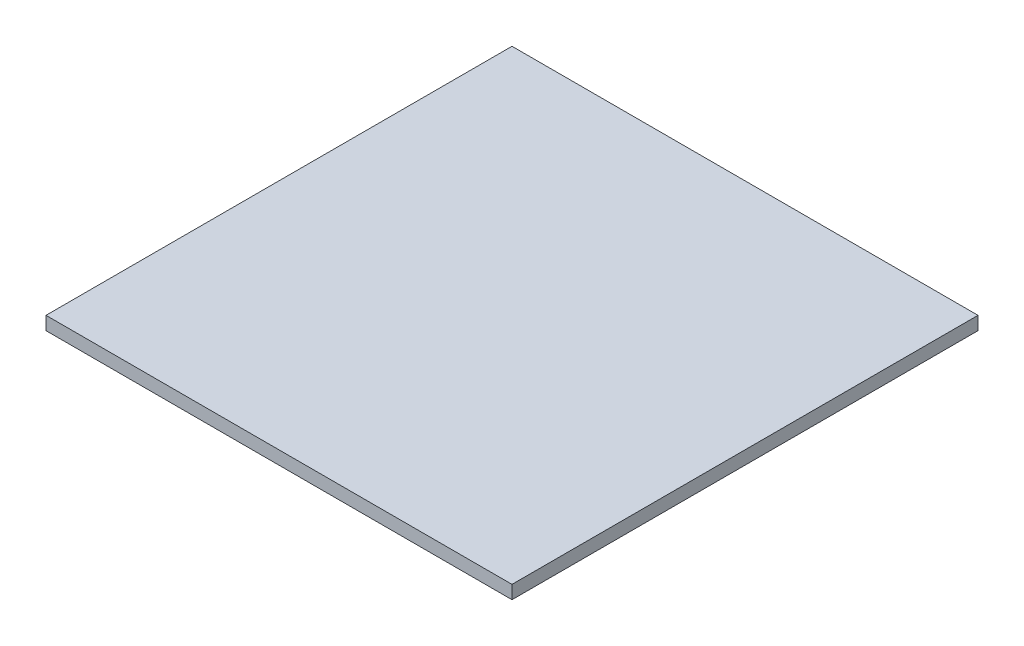
ISO-10303-21;
HEADER;
FILE_DESCRIPTION(('STEP AP214'),'2;1');
FILE_NAME('part.step','',(''),(''),'','','');
FILE_SCHEMA(('AUTOMOTIVE_DESIGN { 1 0 10303 214 1 1 1 1 }'));
ENDSEC;
DATA;
#1=APPLICATION_CONTEXT('core data for automotive mechanical design processes');
#2=APPLICATION_PROTOCOL_DEFINITION('international standard','automotive_design',2000,#1);
#3=PRODUCT_CONTEXT('',#1,'mechanical');
#4=PRODUCT('Part','Part','',(#3));
#5=PRODUCT_RELATED_PRODUCT_CATEGORY('part','',(#4));
#6=PRODUCT_DEFINITION_FORMATION('','',#4);
#7=PRODUCT_DEFINITION_CONTEXT('part definition',#1,'design');
#8=PRODUCT_DEFINITION('design','',#6,#7);
#9=PRODUCT_DEFINITION_SHAPE('','',#8);
#10=(LENGTH_UNIT() NAMED_UNIT(*) SI_UNIT(.MILLI.,.METRE.));
#11=(NAMED_UNIT(*) PLANE_ANGLE_UNIT() SI_UNIT($,.RADIAN.));
#12=(NAMED_UNIT(*) SI_UNIT($,.STERADIAN.) SOLID_ANGLE_UNIT());
#13=UNCERTAINTY_MEASURE_WITH_UNIT(LENGTH_MEASURE(1.E-05),#10,'distance_accuracy_value','');
#14=(GEOMETRIC_REPRESENTATION_CONTEXT(3) GLOBAL_UNCERTAINTY_ASSIGNED_CONTEXT((#13)) GLOBAL_UNIT_ASSIGNED_CONTEXT((#10,
#11,#12)) REPRESENTATION_CONTEXT('',''));
#15=CARTESIAN_POINT('',(0.,0.,0.));
#16=DIRECTION('',(0.,0.,1.));
#17=DIRECTION('',(1.,0.,0.));
#18=AXIS2_PLACEMENT_3D('',#15,#16,#17);
#19=CARTESIAN_POINT('',(0.,0.4,0.));
#20=DIRECTION('',(1.,0.,0.));
#21=DIRECTION('',(0.,0.,-1.));
#22=AXIS2_PLACEMENT_3D('',#19,#20,#21);
#23=PLANE('',#22);
#24=DIRECTION('',(0.,0.,1.));
#25=VECTOR('',#24,1.);
#26=CARTESIAN_POINT('',(0.,0.,0.));
#27=LINE('',#26,#25);
#28=CARTESIAN_POINT('',(0.,0.,-14.));
#29=VERTEX_POINT('',#28);
#30=CARTESIAN_POINT('',(0.,0.,0.));
#31=VERTEX_POINT('',#30);
#32=EDGE_CURVE('E96',#29,#31,#27,.T.);
#33=ORIENTED_EDGE('',*,*,#32,.T.);
#34=DIRECTION('',(0.,-1.,0.));
#35=VECTOR('',#34,1.);
#36=CARTESIAN_POINT('',(0.,0.4,0.));
#37=LINE('',#36,#35);
#38=CARTESIAN_POINT('',(0.,0.4,0.));
#39=VERTEX_POINT('',#38);
#40=EDGE_CURVE('E11',#39,#31,#37,.T.);
#41=ORIENTED_EDGE('',*,*,#40,.F.);
#42=DIRECTION('',(0.,0.,1.));
#43=VECTOR('',#42,1.);
#44=CARTESIAN_POINT('',(0.,0.4,0.));
#45=LINE('',#44,#43);
#46=CARTESIAN_POINT('',(0.,0.4,-14.));
#47=VERTEX_POINT('',#46);
#48=EDGE_CURVE('E84',#47,#39,#45,.T.);
#49=ORIENTED_EDGE('',*,*,#48,.F.);
#50=DIRECTION('',(0.,-1.,0.));
#51=VECTOR('',#50,1.);
#52=CARTESIAN_POINT('',(0.,0.4,-14.));
#53=LINE('',#52,#51);
#54=EDGE_CURVE('E92',#47,#29,#53,.T.);
#55=ORIENTED_EDGE('',*,*,#54,.T.);
#56=EDGE_LOOP('',(#33,#41,#49,#55));
#57=FACE_BOUND('',#56,.T.);
#58=ADVANCED_FACE('F33',(#57),#23,.F.);
#59=CARTESIAN_POINT('',(0.,0.4,0.));
#60=DIRECTION('',(0.,0.,-1.));
#61=DIRECTION('',(-1.,0.,0.));
#62=AXIS2_PLACEMENT_3D('',#59,#60,#61);
#63=PLANE('',#62);
#64=DIRECTION('',(1.,0.,0.));
#65=VECTOR('',#64,1.);
#66=CARTESIAN_POINT('',(0.,0.,0.));
#67=LINE('',#66,#65);
#68=CARTESIAN_POINT('',(14.,0.,0.));
#69=VERTEX_POINT('',#68);
#70=EDGE_CURVE('E88',#31,#69,#67,.T.);
#71=ORIENTED_EDGE('',*,*,#70,.T.);
#72=DIRECTION('',(0.,-1.,0.));
#73=VECTOR('',#72,1.);
#74=CARTESIAN_POINT('',(14.,0.4,0.));
#75=LINE('',#74,#73);
#76=CARTESIAN_POINT('',(14.,0.4,0.));
#77=VERTEX_POINT('',#76);
#78=EDGE_CURVE('E41',#77,#69,#75,.T.);
#79=ORIENTED_EDGE('',*,*,#78,.F.);
#80=DIRECTION('',(1.,0.,0.));
#81=VECTOR('',#80,1.);
#82=CARTESIAN_POINT('',(0.,0.4,0.));
#83=LINE('',#82,#81);
#84=EDGE_CURVE('E79',#39,#77,#83,.T.);
#85=ORIENTED_EDGE('',*,*,#84,.F.);
#86=ORIENTED_EDGE('',*,*,#40,.T.);
#87=EDGE_LOOP('',(#71,#79,#85,#86));
#88=FACE_BOUND('',#87,.T.);
#89=ADVANCED_FACE('F87',(#88),#63,.F.);
#90=CARTESIAN_POINT('',(14.,0.4,0.));
#91=DIRECTION('',(-1.,0.,0.));
#92=DIRECTION('',(0.,0.,1.));
#93=AXIS2_PLACEMENT_3D('',#90,#91,#92);
#94=PLANE('',#93);
#95=DIRECTION('',(0.,0.,-1.));
#96=VECTOR('',#95,1.);
#97=CARTESIAN_POINT('',(14.,0.,0.));
#98=LINE('',#97,#96);
#99=CARTESIAN_POINT('',(14.,0.,-14.));
#100=VERTEX_POINT('',#99);
#101=EDGE_CURVE('E66',#69,#100,#98,.T.);
#102=ORIENTED_EDGE('',*,*,#101,.T.);
#103=DIRECTION('',(0.,-1.,0.));
#104=VECTOR('',#103,1.);
#105=CARTESIAN_POINT('',(14.,0.4,-14.));
#106=LINE('',#105,#104);
#107=CARTESIAN_POINT('',(14.,0.4,-14.));
#108=VERTEX_POINT('',#107);
#109=EDGE_CURVE('E89',#108,#100,#106,.T.);
#110=ORIENTED_EDGE('',*,*,#109,.F.);
#111=DIRECTION('',(0.,0.,-1.));
#112=VECTOR('',#111,1.);
#113=CARTESIAN_POINT('',(14.,0.4,0.));
#114=LINE('',#113,#112);
#115=EDGE_CURVE('E82',#77,#108,#114,.T.);
#116=ORIENTED_EDGE('',*,*,#115,.F.);
#117=ORIENTED_EDGE('',*,*,#78,.T.);
#118=EDGE_LOOP('',(#102,#110,#116,#117));
#119=FACE_BOUND('',#118,.T.);
#120=ADVANCED_FACE('F90',(#119),#94,.F.);
#121=CARTESIAN_POINT('',(0.,0.4,-14.));
#122=DIRECTION('',(0.,0.,1.));
#123=DIRECTION('',(1.,0.,0.));
#124=AXIS2_PLACEMENT_3D('',#121,#122,#123);
#125=PLANE('',#124);
#126=DIRECTION('',(-1.,0.,0.));
#127=VECTOR('',#126,1.);
#128=CARTESIAN_POINT('',(0.,0.,-14.));
#129=LINE('',#128,#127);
#130=EDGE_CURVE('E72',#100,#29,#129,.T.);
#131=ORIENTED_EDGE('',*,*,#130,.T.);
#132=ORIENTED_EDGE('',*,*,#54,.F.);
#133=DIRECTION('',(-1.,0.,0.));
#134=VECTOR('',#133,1.);
#135=CARTESIAN_POINT('',(0.,0.4,-14.));
#136=LINE('',#135,#134);
#137=EDGE_CURVE('E49',#108,#47,#136,.T.);
#138=ORIENTED_EDGE('',*,*,#137,.F.);
#139=ORIENTED_EDGE('',*,*,#109,.T.);
#140=EDGE_LOOP('',(#131,#132,#138,#139));
#141=FACE_BOUND('',#140,.T.);
#142=ADVANCED_FACE('F103',(#141),#125,.F.);
#143=CARTESIAN_POINT('',(0.,0.4,0.));
#144=DIRECTION('',(0.,-1.,0.));
#145=DIRECTION('',(0.,0.,-1.));
#146=AXIS2_PLACEMENT_3D('',#143,#144,#145);
#147=PLANE('',#146);
#148=ORIENTED_EDGE('',*,*,#48,.T.);
#149=ORIENTED_EDGE('',*,*,#84,.T.);
#150=ORIENTED_EDGE('',*,*,#115,.T.);
#151=ORIENTED_EDGE('',*,*,#137,.T.);
#152=EDGE_LOOP('',(#148,#149,#150,#151));
#153=FACE_BOUND('',#152,.T.);
#154=ADVANCED_FACE('F80',(#153),#147,.F.);
#155=CARTESIAN_POINT('',(0.,0.,0.));
#156=DIRECTION('',(0.,-1.,0.));
#157=DIRECTION('',(0.,0.,-1.));
#158=AXIS2_PLACEMENT_3D('',#155,#156,#157);
#159=PLANE('',#158);
#160=ORIENTED_EDGE('',*,*,#32,.F.);
#161=ORIENTED_EDGE('',*,*,#130,.F.);
#162=ORIENTED_EDGE('',*,*,#101,.F.);
#163=ORIENTED_EDGE('',*,*,#70,.F.);
#164=EDGE_LOOP('',(#160,#161,#162,#163));
#165=FACE_BOUND('',#164,.T.);
#166=ADVANCED_FACE('F106',(#165),#159,.T.);
#167=CLOSED_SHELL('',(#58,#89,#120,#142,#154,#166));
#168=MANIFOLD_SOLID_BREP('B2',#167);
#169=ADVANCED_BREP_SHAPE_REPRESENTATION('',(#18,#168),#14);
#170=SHAPE_DEFINITION_REPRESENTATION(#9,#169);
ENDSEC;
END-ISO-10303-21;
